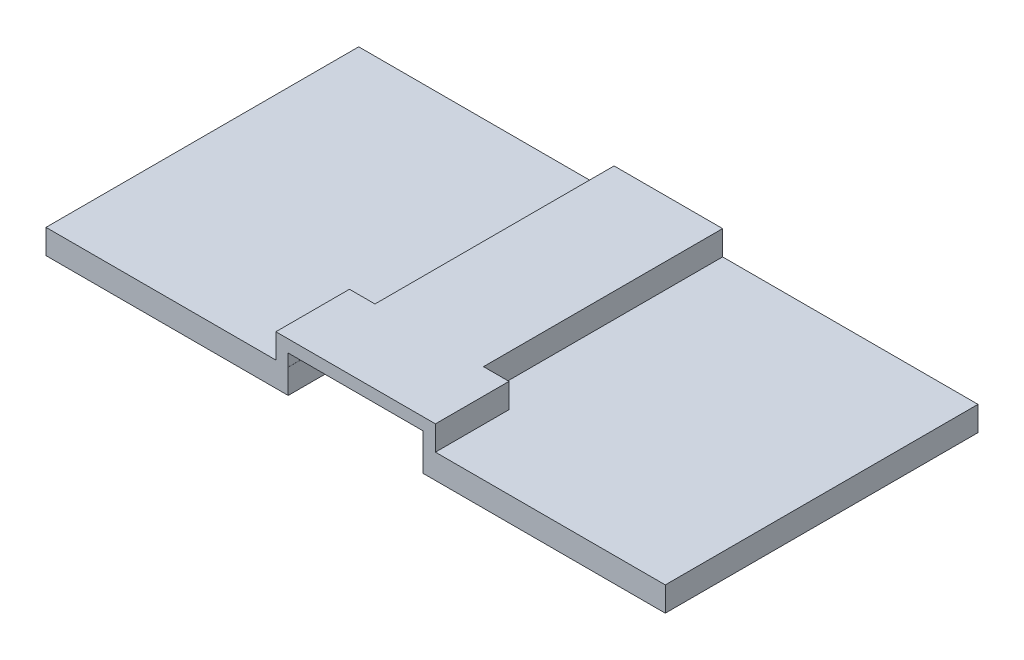
ISO-10303-21;
HEADER;
FILE_DESCRIPTION(('STEP AP214'),'2;1');
FILE_NAME('part.step','',(''),(''),'','','');
FILE_SCHEMA(('AUTOMOTIVE_DESIGN { 1 0 10303 214 1 1 1 1 }'));
ENDSEC;
DATA;
#1=APPLICATION_CONTEXT('core data for automotive mechanical design processes');
#2=APPLICATION_PROTOCOL_DEFINITION('international standard','automotive_design',2000,#1);
#3=PRODUCT_CONTEXT('',#1,'mechanical');
#4=PRODUCT('Part','Part','',(#3));
#5=PRODUCT_RELATED_PRODUCT_CATEGORY('part','',(#4));
#6=PRODUCT_DEFINITION_FORMATION('','',#4);
#7=PRODUCT_DEFINITION_CONTEXT('part definition',#1,'design');
#8=PRODUCT_DEFINITION('design','',#6,#7);
#9=PRODUCT_DEFINITION_SHAPE('','',#8);
#10=(LENGTH_UNIT() NAMED_UNIT(*) SI_UNIT(.MILLI.,.METRE.));
#11=(NAMED_UNIT(*) PLANE_ANGLE_UNIT() SI_UNIT($,.RADIAN.));
#12=(NAMED_UNIT(*) SI_UNIT($,.STERADIAN.) SOLID_ANGLE_UNIT());
#13=UNCERTAINTY_MEASURE_WITH_UNIT(LENGTH_MEASURE(1.E-05),#10,'distance_accuracy_value','');
#14=(GEOMETRIC_REPRESENTATION_CONTEXT(3) GLOBAL_UNCERTAINTY_ASSIGNED_CONTEXT((#13)) GLOBAL_UNIT_ASSIGNED_CONTEXT((#10,
#11,#12)) REPRESENTATION_CONTEXT('',''));
#15=CARTESIAN_POINT('',(0.,0.,0.));
#16=DIRECTION('',(0.,0.,1.));
#17=DIRECTION('',(1.,0.,0.));
#18=AXIS2_PLACEMENT_3D('',#15,#16,#17);
#19=CARTESIAN_POINT('',(0.,2.,0.));
#20=DIRECTION('',(0.,1.,0.));
#21=DIRECTION('',(0.,0.,1.));
#22=AXIS2_PLACEMENT_3D('',#19,#20,#21);
#23=PLANE('',#22);
#24=DIRECTION('',(0.,0.,-1.));
#25=VECTOR('',#24,1.);
#26=CARTESIAN_POINT('',(0.162134831460685,2.,11.8823735955056));
#27=LINE('',#26,#25);
#28=CARTESIAN_POINT('',(0.162134831460685,2.,16.8823735955056));
#29=VERTEX_POINT('',#28);
#30=CARTESIAN_POINT('',(0.162134831460685,2.,10.8823735955056));
#31=VERTEX_POINT('',#30);
#32=EDGE_CURVE('E222',#29,#31,#27,.T.);
#33=ORIENTED_EDGE('',*,*,#32,.T.);
#34=DIRECTION('',(-1.,0.,0.));
#35=VECTOR('',#34,1.);
#36=CARTESIAN_POINT('',(2.24213483146068,2.,10.8823735955056));
#37=LINE('',#36,#35);
#38=CARTESIAN_POINT('',(2.24213483146068,2.,10.8823735955056));
#39=VERTEX_POINT('',#38);
#40=EDGE_CURVE('E352',#39,#31,#37,.T.);
#41=ORIENTED_EDGE('',*,*,#40,.F.);
#42=DIRECTION('',(0.,0.,1.));
#43=VECTOR('',#42,1.);
#44=CARTESIAN_POINT('',(2.24213483146068,2.,-8.61762640449438));
#45=LINE('',#44,#43);
#46=CARTESIAN_POINT('',(2.24213483146068,2.,-8.61762640449438));
#47=VERTEX_POINT('',#46);
#48=EDGE_CURVE('E195',#47,#39,#45,.T.);
#49=ORIENTED_EDGE('',*,*,#48,.F.);
#50=DIRECTION('',(-1.,0.,0.));
#51=VECTOR('',#50,1.);
#52=CARTESIAN_POINT('',(-18.5828651685393,2.,-8.61762640449438));
#53=LINE('',#52,#51);
#54=CARTESIAN_POINT('',(-18.5828651685393,2.,-8.61762640449438));
#55=VERTEX_POINT('',#54);
#56=EDGE_CURVE('E276',#47,#55,#53,.T.);
#57=ORIENTED_EDGE('',*,*,#56,.T.);
#58=DIRECTION('',(0.,0.,1.));
#59=VECTOR('',#58,1.);
#60=CARTESIAN_POINT('',(-18.5828651685393,2.,-8.61762640449438));
#61=LINE('',#60,#59);
#62=CARTESIAN_POINT('',(-18.5828651685393,2.,16.8823735955056));
#63=VERTEX_POINT('',#62);
#64=EDGE_CURVE('E265',#55,#63,#61,.T.);
#65=ORIENTED_EDGE('',*,*,#64,.T.);
#66=DIRECTION('',(1.,0.,0.));
#67=VECTOR('',#66,1.);
#68=CARTESIAN_POINT('',(-18.5828651685393,2.,16.8823735955056));
#69=LINE('',#68,#67);
#70=EDGE_CURVE('E270',#63,#29,#69,.T.);
#71=ORIENTED_EDGE('',*,*,#70,.T.);
#72=EDGE_LOOP('',(#33,#41,#49,#57,#65,#71));
#73=FACE_BOUND('',#72,.T.);
#74=ADVANCED_FACE('F39',(#73),#23,.T.);
#75=DIRECTION('',(0.,0.,1.));
#76=VECTOR('',#75,1.);
#77=CARTESIAN_POINT('',(1.16713483146069,2.,11.8823735955056));
#78=LINE('',#77,#76);
#79=CARTESIAN_POINT('',(1.16713483146069,2.,11.8823735955056));
#80=VERTEX_POINT('',#79);
#81=CARTESIAN_POINT('',(1.16713483146069,2.,16.8823735955056));
#82=VERTEX_POINT('',#81);
#83=EDGE_CURVE('E238',#80,#82,#78,.T.);
#84=ORIENTED_EDGE('',*,*,#83,.F.);
#85=DIRECTION('',(1.,0.,0.));
#86=VECTOR('',#85,1.);
#87=CARTESIAN_POINT('',(2.24213483146068,2.,11.8823735955056));
#88=LINE('',#87,#86);
#89=CARTESIAN_POINT('',(1.16213483146068,2.,11.8823735955056));
#90=VERTEX_POINT('',#89);
#91=EDGE_CURVE('E187',#90,#80,#88,.T.);
#92=ORIENTED_EDGE('',*,*,#91,.F.);
#93=DIRECTION('',(0.,0.,1.));
#94=VECTOR('',#93,1.);
#95=CARTESIAN_POINT('',(1.16213483146068,2.,11.8823735955056));
#96=LINE('',#95,#94);
#97=CARTESIAN_POINT('',(1.16213483146068,2.,16.8823735955056));
#98=VERTEX_POINT('',#97);
#99=EDGE_CURVE('E224',#90,#98,#96,.T.);
#100=ORIENTED_EDGE('',*,*,#99,.T.);
#101=EDGE_CURVE('E274',#98,#82,#69,.T.);
#102=ORIENTED_EDGE('',*,*,#101,.T.);
#103=EDGE_LOOP('',(#84,#92,#100,#102));
#104=FACE_BOUND('',#103,.T.);
#105=ADVANCED_FACE('F387',(#104),#23,.T.);
#106=CARTESIAN_POINT('',(2.24213483146068,3.,-8.61762640449438));
#107=DIRECTION('',(1.,0.,0.));
#108=DIRECTION('',(0.,0.,-1.));
#109=AXIS2_PLACEMENT_3D('',#106,#107,#108);
#110=PLANE('',#109);
#111=DIRECTION('',(0.,-1.,0.));
#112=VECTOR('',#111,1.);
#113=CARTESIAN_POINT('',(2.24213483146068,4.,10.8823735955056));
#114=LINE('',#113,#112);
#115=CARTESIAN_POINT('',(2.24213483146068,4.,10.8823735955056));
#116=VERTEX_POINT('',#115);
#117=EDGE_CURVE('E180',#116,#39,#114,.T.);
#118=ORIENTED_EDGE('',*,*,#117,.F.);
#119=DIRECTION('',(0.,0.,1.));
#120=VECTOR('',#119,1.);
#121=CARTESIAN_POINT('',(2.24213483146068,4.,-8.61762640449438));
#122=LINE('',#121,#120);
#123=CARTESIAN_POINT('',(2.24213483146068,4.,-8.61762640449438));
#124=VERTEX_POINT('',#123);
#125=EDGE_CURVE('E193',#124,#116,#122,.T.);
#126=ORIENTED_EDGE('',*,*,#125,.F.);
#127=DIRECTION('',(0.,-1.,0.));
#128=VECTOR('',#127,1.);
#129=CARTESIAN_POINT('',(2.24213483146068,3.,-8.61762640449438));
#130=LINE('',#129,#128);
#131=EDGE_CURVE('E211',#124,#47,#130,.T.);
#132=ORIENTED_EDGE('',*,*,#131,.T.);
#133=ORIENTED_EDGE('',*,*,#48,.T.);
#134=EDGE_LOOP('',(#118,#126,#132,#133));
#135=FACE_BOUND('',#134,.T.);
#136=ADVANCED_FACE('F192',(#135),#110,.F.);
#137=DIRECTION('',(0.,0.,-1.));
#138=VECTOR('',#137,1.);
#139=CARTESIAN_POINT('',(12.1721348314607,2.,11.8823735955056));
#140=LINE('',#139,#138);
#141=CARTESIAN_POINT('',(12.1721348314607,2.,16.8823735955056));
#142=VERTEX_POINT('',#141);
#143=CARTESIAN_POINT('',(12.1721348314607,2.,11.8823735955056));
#144=VERTEX_POINT('',#143);
#145=EDGE_CURVE('E54',#142,#144,#140,.T.);
#146=ORIENTED_EDGE('',*,*,#145,.T.);
#147=DIRECTION('',(1.,0.,0.));
#148=VECTOR('',#147,1.);
#149=CARTESIAN_POINT('',(11.0921348314607,2.,11.8823735955056));
#150=LINE('',#149,#148);
#151=CARTESIAN_POINT('',(12.1671348314607,2.,11.8823735955056));
#152=VERTEX_POINT('',#151);
#153=EDGE_CURVE('E196',#152,#144,#150,.T.);
#154=ORIENTED_EDGE('',*,*,#153,.F.);
#155=DIRECTION('',(0.,0.,-1.));
#156=VECTOR('',#155,1.);
#157=CARTESIAN_POINT('',(12.1671348314607,2.,11.8823735955056));
#158=LINE('',#157,#156);
#159=CARTESIAN_POINT('',(12.1671348314607,2.,16.8823735955056));
#160=VERTEX_POINT('',#159);
#161=EDGE_CURVE('E243',#160,#152,#158,.T.);
#162=ORIENTED_EDGE('',*,*,#161,.F.);
#163=EDGE_CURVE('E59',#160,#142,#69,.T.);
#164=ORIENTED_EDGE('',*,*,#163,.T.);
#165=EDGE_LOOP('',(#146,#154,#162,#164));
#166=FACE_BOUND('',#165,.T.);
#167=ADVANCED_FACE('F383',(#166),#23,.T.);
#168=DIRECTION('',(-1.,0.,0.));
#169=VECTOR('',#168,1.);
#170=CARTESIAN_POINT('',(11.0921348314607,2.,10.8823735955056));
#171=LINE('',#170,#169);
#172=CARTESIAN_POINT('',(13.1721348314607,2.,10.8823735955056));
#173=VERTEX_POINT('',#172);
#174=CARTESIAN_POINT('',(11.0921348314607,2.,10.8823735955056));
#175=VERTEX_POINT('',#174);
#176=EDGE_CURVE('E345',#173,#175,#171,.T.);
#177=ORIENTED_EDGE('',*,*,#176,.F.);
#178=DIRECTION('',(0.,0.,1.));
#179=VECTOR('',#178,1.);
#180=CARTESIAN_POINT('',(13.1721348314607,2.,11.8823735955056));
#181=LINE('',#180,#179);
#182=CARTESIAN_POINT('',(13.1721348314607,2.,16.8823735955056));
#183=VERTEX_POINT('',#182);
#184=EDGE_CURVE('E334',#173,#183,#181,.T.);
#185=ORIENTED_EDGE('',*,*,#184,.T.);
#186=CARTESIAN_POINT('',(31.9171348314607,2.,16.8823735955056));
#187=VERTEX_POINT('',#186);
#188=EDGE_CURVE('E268',#183,#187,#69,.T.);
#189=ORIENTED_EDGE('',*,*,#188,.T.);
#190=DIRECTION('',(0.,0.,-1.));
#191=VECTOR('',#190,1.);
#192=CARTESIAN_POINT('',(31.9171348314607,2.,-8.61762640449438));
#193=LINE('',#192,#191);
#194=CARTESIAN_POINT('',(31.9171348314607,2.,-8.61762640449438));
#195=VERTEX_POINT('',#194);
#196=EDGE_CURVE('E273',#187,#195,#193,.T.);
#197=ORIENTED_EDGE('',*,*,#196,.T.);
#198=CARTESIAN_POINT('',(11.0921348314607,2.,-8.61762640449438));
#199=VERTEX_POINT('',#198);
#200=EDGE_CURVE('E277',#195,#199,#53,.T.);
#201=ORIENTED_EDGE('',*,*,#200,.T.);
#202=DIRECTION('',(0.,0.,-1.));
#203=VECTOR('',#202,1.);
#204=CARTESIAN_POINT('',(11.0921348314607,2.,-8.61762640449438));
#205=LINE('',#204,#203);
#206=EDGE_CURVE('E203',#175,#199,#205,.T.);
#207=ORIENTED_EDGE('',*,*,#206,.F.);
#208=EDGE_LOOP('',(#177,#185,#189,#197,#201,#207));
#209=FACE_BOUND('',#208,.T.);
#210=ADVANCED_FACE('F364',(#209),#23,.T.);
#211=CARTESIAN_POINT('',(11.0921348314607,3.,-8.61762640449438));
#212=DIRECTION('',(-1.,0.,0.));
#213=DIRECTION('',(0.,0.,1.));
#214=AXIS2_PLACEMENT_3D('',#211,#212,#213);
#215=PLANE('',#214);
#216=DIRECTION('',(0.,-1.,0.));
#217=VECTOR('',#216,1.);
#218=CARTESIAN_POINT('',(11.0921348314607,4.,10.8823735955056));
#219=LINE('',#218,#217);
#220=CARTESIAN_POINT('',(11.0921348314607,4.,10.8823735955056));
#221=VERTEX_POINT('',#220);
#222=EDGE_CURVE('E341',#221,#175,#219,.T.);
#223=ORIENTED_EDGE('',*,*,#222,.T.);
#224=ORIENTED_EDGE('',*,*,#206,.T.);
#225=DIRECTION('',(0.,-1.,0.));
#226=VECTOR('',#225,1.);
#227=CARTESIAN_POINT('',(11.0921348314607,3.,-8.61762640449438));
#228=LINE('',#227,#226);
#229=CARTESIAN_POINT('',(11.0921348314607,4.,-8.61762640449438));
#230=VERTEX_POINT('',#229);
#231=EDGE_CURVE('E209',#230,#199,#228,.T.);
#232=ORIENTED_EDGE('',*,*,#231,.F.);
#233=DIRECTION('',(0.,0.,-1.));
#234=VECTOR('',#233,1.);
#235=CARTESIAN_POINT('',(11.0921348314607,4.,-8.61762640449438));
#236=LINE('',#235,#234);
#237=EDGE_CURVE('E202',#221,#230,#236,.T.);
#238=ORIENTED_EDGE('',*,*,#237,.F.);
#239=EDGE_LOOP('',(#223,#224,#232,#238));
#240=FACE_BOUND('',#239,.T.);
#241=ADVANCED_FACE('F372',(#240),#215,.F.);
#242=CARTESIAN_POINT('',(2.24213483146069,3.,16.8823735955056));
#243=DIRECTION('',(0.,1.,0.));
#244=DIRECTION('',(0.,0.,1.));
#245=AXIS2_PLACEMENT_3D('',#242,#243,#244);
#246=PLANE('',#245);
#247=DIRECTION('',(0.,0.,-1.));
#248=VECTOR('',#247,1.);
#249=CARTESIAN_POINT('',(12.1721348314607,3.,11.8823735955056));
#250=LINE('',#249,#248);
#251=CARTESIAN_POINT('',(12.1721348314607,3.,16.8823735955056));
#252=VERTEX_POINT('',#251);
#253=CARTESIAN_POINT('',(12.1721348314607,3.,11.8823735955056));
#254=VERTEX_POINT('',#253);
#255=EDGE_CURVE('E331',#252,#254,#250,.T.);
#256=ORIENTED_EDGE('',*,*,#255,.F.);
#257=DIRECTION('',(1.,0.,0.));
#258=VECTOR('',#257,1.);
#259=CARTESIAN_POINT('',(2.24213483146069,3.,16.8823735955056));
#260=LINE('',#259,#258);
#261=CARTESIAN_POINT('',(1.16213483146068,3.,16.8823735955056));
#262=VERTEX_POINT('',#261);
#263=EDGE_CURVE('E322',#262,#252,#260,.T.);
#264=ORIENTED_EDGE('',*,*,#263,.F.);
#265=DIRECTION('',(0.,0.,1.));
#266=VECTOR('',#265,1.);
#267=CARTESIAN_POINT('',(1.16213483146068,3.,11.8823735955056));
#268=LINE('',#267,#266);
#269=CARTESIAN_POINT('',(1.16213483146068,3.,11.8823735955056));
#270=VERTEX_POINT('',#269);
#271=EDGE_CURVE('E225',#270,#262,#268,.T.);
#272=ORIENTED_EDGE('',*,*,#271,.F.);
#273=DIRECTION('',(1.,0.,0.));
#274=VECTOR('',#273,1.);
#275=CARTESIAN_POINT('',(2.24213483146069,3.,11.8823735955056));
#276=LINE('',#275,#274);
#277=EDGE_CURVE('E221',#270,#254,#276,.T.);
#278=ORIENTED_EDGE('',*,*,#277,.T.);
#279=EDGE_LOOP('',(#256,#264,#272,#278));
#280=FACE_BOUND('',#279,.T.);
#281=ADVANCED_FACE('F374',(#280),#246,.F.);
#282=CARTESIAN_POINT('',(-18.5828651685393,2.,-8.61762640449438));
#283=DIRECTION('',(1.,0.,0.));
#284=DIRECTION('',(0.,0.,-1.));
#285=AXIS2_PLACEMENT_3D('',#282,#283,#284);
#286=PLANE('',#285);
#287=DIRECTION('',(0.,0.,1.));
#288=VECTOR('',#287,1.);
#289=CARTESIAN_POINT('',(-18.5828651685393,0.,-8.61762640449438));
#290=LINE('',#289,#288);
#291=CARTESIAN_POINT('',(-18.5828651685393,0.,-8.61762640449438));
#292=VERTEX_POINT('',#291);
#293=CARTESIAN_POINT('',(-18.5828651685393,0.,16.8823735955056));
#294=VERTEX_POINT('',#293);
#295=EDGE_CURVE('E257',#292,#294,#290,.T.);
#296=ORIENTED_EDGE('',*,*,#295,.T.);
#297=DIRECTION('',(0.,-1.,0.));
#298=VECTOR('',#297,1.);
#299=CARTESIAN_POINT('',(-18.5828651685393,2.,16.8823735955056));
#300=LINE('',#299,#298);
#301=EDGE_CURVE('E12',#63,#294,#300,.T.);
#302=ORIENTED_EDGE('',*,*,#301,.F.);
#303=ORIENTED_EDGE('',*,*,#64,.F.);
#304=DIRECTION('',(0.,-1.,0.));
#305=VECTOR('',#304,1.);
#306=CARTESIAN_POINT('',(-18.5828651685393,2.,-8.61762640449438));
#307=LINE('',#306,#305);
#308=EDGE_CURVE('E280',#55,#292,#307,.T.);
#309=ORIENTED_EDGE('',*,*,#308,.T.);
#310=EDGE_LOOP('',(#296,#302,#303,#309));
#311=FACE_BOUND('',#310,.T.);
#312=ADVANCED_FACE('F41',(#311),#286,.F.);
#313=CARTESIAN_POINT('',(-18.5828651685393,2.,16.8823735955056));
#314=DIRECTION('',(0.,0.,-1.));
#315=DIRECTION('',(-1.,0.,0.));
#316=AXIS2_PLACEMENT_3D('',#313,#314,#315);
#317=PLANE('',#316);
#318=ORIENTED_EDGE('',*,*,#163,.F.);
#319=DIRECTION('',(0.,1.,0.));
#320=VECTOR('',#319,1.);
#321=CARTESIAN_POINT('',(12.1671348314607,0.,16.8823735955056));
#322=LINE('',#321,#320);
#323=CARTESIAN_POINT('',(12.1671348314607,0.,16.8823735955056));
#324=VERTEX_POINT('',#323);
#325=EDGE_CURVE('E261',#324,#160,#322,.T.);
#326=ORIENTED_EDGE('',*,*,#325,.F.);
#327=DIRECTION('',(1.,0.,0.));
#328=VECTOR('',#327,1.);
#329=CARTESIAN_POINT('',(-18.5828651685393,0.,16.8823735955056));
#330=LINE('',#329,#328);
#331=CARTESIAN_POINT('',(31.9171348314607,0.,16.8823735955056));
#332=VERTEX_POINT('',#331);
#333=EDGE_CURVE('E283',#324,#332,#330,.T.);
#334=ORIENTED_EDGE('',*,*,#333,.T.);
#335=DIRECTION('',(0.,-1.,0.));
#336=VECTOR('',#335,1.);
#337=CARTESIAN_POINT('',(31.9171348314607,2.,16.8823735955056));
#338=LINE('',#337,#336);
#339=EDGE_CURVE('E47',#187,#332,#338,.T.);
#340=ORIENTED_EDGE('',*,*,#339,.F.);
#341=ORIENTED_EDGE('',*,*,#188,.F.);
#342=DIRECTION('',(0.,1.,0.));
#343=VECTOR('',#342,1.);
#344=CARTESIAN_POINT('',(13.1721348314607,3.,16.8823735955056));
#345=LINE('',#344,#343);
#346=CARTESIAN_POINT('',(13.1721348314607,4.,16.8823735955056));
#347=VERTEX_POINT('',#346);
#348=EDGE_CURVE('E215',#183,#347,#345,.T.);
#349=ORIENTED_EDGE('',*,*,#348,.T.);
#350=DIRECTION('',(-1.,0.,0.));
#351=VECTOR('',#350,1.);
#352=CARTESIAN_POINT('',(2.24213483146069,4.,16.8823735955056));
#353=LINE('',#352,#351);
#354=CARTESIAN_POINT('',(0.162134831460687,4.,16.8823735955056));
#355=VERTEX_POINT('',#354);
#356=EDGE_CURVE('E320',#347,#355,#353,.T.);
#357=ORIENTED_EDGE('',*,*,#356,.T.);
#358=DIRECTION('',(0.,1.,0.));
#359=VECTOR('',#358,1.);
#360=CARTESIAN_POINT('',(0.162134831460685,2.,16.8823735955056));
#361=LINE('',#360,#359);
#362=EDGE_CURVE('E228',#29,#355,#361,.T.);
#363=ORIENTED_EDGE('',*,*,#362,.F.);
#364=ORIENTED_EDGE('',*,*,#70,.F.);
#365=ORIENTED_EDGE('',*,*,#301,.T.);
#366=CARTESIAN_POINT('',(1.16713483146069,0.,16.8823735955056));
#367=VERTEX_POINT('',#366);
#368=EDGE_CURVE('E284',#294,#367,#330,.T.);
#369=ORIENTED_EDGE('',*,*,#368,.T.);
#370=DIRECTION('',(0.,1.,0.));
#371=VECTOR('',#370,1.);
#372=CARTESIAN_POINT('',(1.16713483146069,0.,16.8823735955056));
#373=LINE('',#372,#371);
#374=EDGE_CURVE('E249',#367,#82,#373,.T.);
#375=ORIENTED_EDGE('',*,*,#374,.T.);
#376=ORIENTED_EDGE('',*,*,#101,.F.);
#377=DIRECTION('',(0.,1.,0.));
#378=VECTOR('',#377,1.);
#379=CARTESIAN_POINT('',(1.16213483146068,2.,16.8823735955056));
#380=LINE('',#379,#378);
#381=EDGE_CURVE('E232',#98,#262,#380,.T.);
#382=ORIENTED_EDGE('',*,*,#381,.T.);
#383=ORIENTED_EDGE('',*,*,#263,.T.);
#384=DIRECTION('',(0.,1.,0.));
#385=VECTOR('',#384,1.);
#386=CARTESIAN_POINT('',(12.1721348314607,2.,16.8823735955056));
#387=LINE('',#386,#385);
#388=EDGE_CURVE('E216',#142,#252,#387,.T.);
#389=ORIENTED_EDGE('',*,*,#388,.F.);
#390=EDGE_LOOP('',(#318,#326,#334,#340,#341,#349,#357,#363,#364,#365,#369,#375,#376,#382,#383,#389));
#391=FACE_BOUND('',#390,.T.);
#392=ADVANCED_FACE('F361',(#391),#317,.F.);
#393=CARTESIAN_POINT('',(31.9171348314607,2.,-8.61762640449438));
#394=DIRECTION('',(-1.,0.,0.));
#395=DIRECTION('',(0.,0.,1.));
#396=AXIS2_PLACEMENT_3D('',#393,#394,#395);
#397=PLANE('',#396);
#398=DIRECTION('',(0.,0.,-1.));
#399=VECTOR('',#398,1.);
#400=CARTESIAN_POINT('',(31.9171348314607,0.,-8.61762640449438));
#401=LINE('',#400,#399);
#402=CARTESIAN_POINT('',(31.9171348314607,0.,-8.61762640449438));
#403=VERTEX_POINT('',#402);
#404=EDGE_CURVE('E287',#332,#403,#401,.T.);
#405=ORIENTED_EDGE('',*,*,#404,.T.);
#406=DIRECTION('',(0.,-1.,0.));
#407=VECTOR('',#406,1.);
#408=CARTESIAN_POINT('',(31.9171348314607,2.,-8.61762640449438));
#409=LINE('',#408,#407);
#410=EDGE_CURVE('E292',#195,#403,#409,.T.);
#411=ORIENTED_EDGE('',*,*,#410,.F.);
#412=ORIENTED_EDGE('',*,*,#196,.F.);
#413=ORIENTED_EDGE('',*,*,#339,.T.);
#414=EDGE_LOOP('',(#405,#411,#412,#413));
#415=FACE_BOUND('',#414,.T.);
#416=ADVANCED_FACE('F299',(#415),#397,.F.);
#417=CARTESIAN_POINT('',(-18.5828651685393,2.,-8.61762640449438));
#418=DIRECTION('',(0.,0.,1.));
#419=DIRECTION('',(1.,0.,0.));
#420=AXIS2_PLACEMENT_3D('',#417,#418,#419);
#421=PLANE('',#420);
#422=DIRECTION('',(-1.,0.,0.));
#423=VECTOR('',#422,1.);
#424=CARTESIAN_POINT('',(-18.5828651685393,0.,-8.61762640449438));
#425=LINE('',#424,#423);
#426=EDGE_CURVE('E269',#403,#292,#425,.T.);
#427=ORIENTED_EDGE('',*,*,#426,.T.);
#428=ORIENTED_EDGE('',*,*,#308,.F.);
#429=ORIENTED_EDGE('',*,*,#56,.F.);
#430=ORIENTED_EDGE('',*,*,#131,.F.);
#431=DIRECTION('',(-1.,0.,0.));
#432=VECTOR('',#431,1.);
#433=CARTESIAN_POINT('',(2.24213483146068,4.,-8.61762640449438));
#434=LINE('',#433,#432);
#435=EDGE_CURVE('E200',#230,#124,#434,.T.);
#436=ORIENTED_EDGE('',*,*,#435,.F.);
#437=ORIENTED_EDGE('',*,*,#231,.T.);
#438=ORIENTED_EDGE('',*,*,#200,.F.);
#439=ORIENTED_EDGE('',*,*,#410,.T.);
#440=EDGE_LOOP('',(#427,#428,#429,#430,#436,#437,#438,#439));
#441=FACE_BOUND('',#440,.T.);
#442=ADVANCED_FACE('F310',(#441),#421,.F.);
#443=CARTESIAN_POINT('',(0.,0.,0.));
#444=DIRECTION('',(0.,1.,0.));
#445=DIRECTION('',(0.,0.,1.));
#446=AXIS2_PLACEMENT_3D('',#443,#444,#445);
#447=PLANE('',#446);
#448=DIRECTION('',(-1.,0.,0.));
#449=VECTOR('',#448,1.);
#450=CARTESIAN_POINT('',(1.16713483146069,0.,11.8823735955056));
#451=LINE('',#450,#449);
#452=CARTESIAN_POINT('',(12.1671348314607,0.,11.8823735955056));
#453=VERTEX_POINT('',#452);
#454=CARTESIAN_POINT('',(1.16713483146069,0.,11.8823735955056));
#455=VERTEX_POINT('',#454);
#456=EDGE_CURVE('E246',#453,#455,#451,.T.);
#457=ORIENTED_EDGE('',*,*,#456,.T.);
#458=DIRECTION('',(0.,0.,1.));
#459=VECTOR('',#458,1.);
#460=CARTESIAN_POINT('',(1.16713483146069,0.,11.8823735955056));
#461=LINE('',#460,#459);
#462=EDGE_CURVE('E239',#455,#367,#461,.T.);
#463=ORIENTED_EDGE('',*,*,#462,.T.);
#464=ORIENTED_EDGE('',*,*,#368,.F.);
#465=ORIENTED_EDGE('',*,*,#295,.F.);
#466=ORIENTED_EDGE('',*,*,#426,.F.);
#467=ORIENTED_EDGE('',*,*,#404,.F.);
#468=ORIENTED_EDGE('',*,*,#333,.F.);
#469=DIRECTION('',(0.,0.,-1.));
#470=VECTOR('',#469,1.);
#471=CARTESIAN_POINT('',(12.1671348314607,0.,11.8823735955056));
#472=LINE('',#471,#470);
#473=EDGE_CURVE('E242',#324,#453,#472,.T.);
#474=ORIENTED_EDGE('',*,*,#473,.T.);
#475=EDGE_LOOP('',(#457,#463,#464,#465,#466,#467,#468,#474));
#476=FACE_BOUND('',#475,.T.);
#477=ADVANCED_FACE('F306',(#476),#447,.F.);
#478=CARTESIAN_POINT('',(1.16713483146069,0.,11.8823735955056));
#479=DIRECTION('',(-1.,0.,0.));
#480=DIRECTION('',(0.,0.,1.));
#481=AXIS2_PLACEMENT_3D('',#478,#479,#480);
#482=PLANE('',#481);
#483=ORIENTED_EDGE('',*,*,#83,.T.);
#484=ORIENTED_EDGE('',*,*,#374,.F.);
#485=ORIENTED_EDGE('',*,*,#462,.F.);
#486=DIRECTION('',(0.,1.,0.));
#487=VECTOR('',#486,1.);
#488=CARTESIAN_POINT('',(1.16713483146069,0.,11.8823735955056));
#489=LINE('',#488,#487);
#490=EDGE_CURVE('E254',#455,#80,#489,.T.);
#491=ORIENTED_EDGE('',*,*,#490,.T.);
#492=EDGE_LOOP('',(#483,#484,#485,#491));
#493=FACE_BOUND('',#492,.T.);
#494=ADVANCED_FACE('F395',(#493),#482,.F.);
#495=CARTESIAN_POINT('',(1.16713483146069,0.,11.8823735955056));
#496=DIRECTION('',(0.,0.,-1.));
#497=DIRECTION('',(-1.,0.,0.));
#498=AXIS2_PLACEMENT_3D('',#495,#496,#497);
#499=PLANE('',#498);
#500=ORIENTED_EDGE('',*,*,#91,.T.);
#501=ORIENTED_EDGE('',*,*,#490,.F.);
#502=ORIENTED_EDGE('',*,*,#456,.F.);
#503=DIRECTION('',(0.,1.,0.));
#504=VECTOR('',#503,1.);
#505=CARTESIAN_POINT('',(12.1671348314607,0.,11.8823735955056));
#506=LINE('',#505,#504);
#507=EDGE_CURVE('E258',#453,#152,#506,.T.);
#508=ORIENTED_EDGE('',*,*,#507,.T.);
#509=ORIENTED_EDGE('',*,*,#153,.T.);
#510=DIRECTION('',(0.,1.,0.));
#511=VECTOR('',#510,1.);
#512=CARTESIAN_POINT('',(12.1721348314607,2.,11.8823735955056));
#513=LINE('',#512,#511);
#514=EDGE_CURVE('E328',#144,#254,#513,.T.);
#515=ORIENTED_EDGE('',*,*,#514,.T.);
#516=ORIENTED_EDGE('',*,*,#277,.F.);
#517=DIRECTION('',(0.,1.,0.));
#518=VECTOR('',#517,1.);
#519=CARTESIAN_POINT('',(1.16213483146068,2.,11.8823735955056));
#520=LINE('',#519,#518);
#521=EDGE_CURVE('E235',#90,#270,#520,.T.);
#522=ORIENTED_EDGE('',*,*,#521,.F.);
#523=EDGE_LOOP('',(#500,#501,#502,#508,#509,#515,#516,#522));
#524=FACE_BOUND('',#523,.T.);
#525=ADVANCED_FACE('F423',(#524),#499,.F.);
#526=CARTESIAN_POINT('',(12.1671348314607,0.,11.8823735955056));
#527=DIRECTION('',(1.,0.,0.));
#528=DIRECTION('',(0.,0.,-1.));
#529=AXIS2_PLACEMENT_3D('',#526,#527,#528);
#530=PLANE('',#529);
#531=ORIENTED_EDGE('',*,*,#161,.T.);
#532=ORIENTED_EDGE('',*,*,#507,.F.);
#533=ORIENTED_EDGE('',*,*,#473,.F.);
#534=ORIENTED_EDGE('',*,*,#325,.T.);
#535=EDGE_LOOP('',(#531,#532,#533,#534));
#536=FACE_BOUND('',#535,.T.);
#537=ADVANCED_FACE('F431',(#536),#530,.F.);
#538=CARTESIAN_POINT('',(0.162134831460685,2.,11.8823735955056));
#539=DIRECTION('',(1.,0.,0.));
#540=DIRECTION('',(0.,0.,-1.));
#541=AXIS2_PLACEMENT_3D('',#538,#539,#540);
#542=PLANE('',#541);
#543=ORIENTED_EDGE('',*,*,#362,.T.);
#544=DIRECTION('',(0.,0.,-1.));
#545=VECTOR('',#544,1.);
#546=CARTESIAN_POINT('',(0.162134831460687,4.,16.8823735955056));
#547=LINE('',#546,#545);
#548=CARTESIAN_POINT('',(0.162134831460685,4.,10.8823735955056));
#549=VERTEX_POINT('',#548);
#550=EDGE_CURVE('E213',#355,#549,#547,.T.);
#551=ORIENTED_EDGE('',*,*,#550,.T.);
#552=DIRECTION('',(0.,-1.,0.));
#553=VECTOR('',#552,1.);
#554=CARTESIAN_POINT('',(0.162134831460685,4.,10.8823735955056));
#555=LINE('',#554,#553);
#556=EDGE_CURVE('E183',#549,#31,#555,.T.);
#557=ORIENTED_EDGE('',*,*,#556,.T.);
#558=ORIENTED_EDGE('',*,*,#32,.F.);
#559=EDGE_LOOP('',(#543,#551,#557,#558));
#560=FACE_BOUND('',#559,.T.);
#561=ADVANCED_FACE('F355',(#560),#542,.F.);
#562=CARTESIAN_POINT('',(1.16213483146068,2.,11.8823735955056));
#563=DIRECTION('',(-1.,0.,0.));
#564=DIRECTION('',(0.,0.,1.));
#565=AXIS2_PLACEMENT_3D('',#562,#563,#564);
#566=PLANE('',#565);
#567=ORIENTED_EDGE('',*,*,#271,.T.);
#568=ORIENTED_EDGE('',*,*,#381,.F.);
#569=ORIENTED_EDGE('',*,*,#99,.F.);
#570=ORIENTED_EDGE('',*,*,#521,.T.);
#571=EDGE_LOOP('',(#567,#568,#569,#570));
#572=FACE_BOUND('',#571,.T.);
#573=ADVANCED_FACE('F507',(#572),#566,.F.);
#574=CARTESIAN_POINT('',(0.,4.,0.));
#575=DIRECTION('',(0.,1.,0.));
#576=DIRECTION('',(0.,0.,1.));
#577=AXIS2_PLACEMENT_3D('',#574,#575,#576);
#578=PLANE('',#577);
#579=ORIENTED_EDGE('',*,*,#125,.T.);
#580=DIRECTION('',(-1.,0.,0.));
#581=VECTOR('',#580,1.);
#582=CARTESIAN_POINT('',(2.24213483146068,4.,10.8823735955056));
#583=LINE('',#582,#581);
#584=EDGE_CURVE('E176',#116,#549,#583,.T.);
#585=ORIENTED_EDGE('',*,*,#584,.T.);
#586=ORIENTED_EDGE('',*,*,#550,.F.);
#587=ORIENTED_EDGE('',*,*,#356,.F.);
#588=DIRECTION('',(0.,0.,-1.));
#589=VECTOR('',#588,1.);
#590=CARTESIAN_POINT('',(13.1721348314607,4.,16.8823735955056));
#591=LINE('',#590,#589);
#592=CARTESIAN_POINT('',(13.1721348314607,4.,10.8823735955056));
#593=VERTEX_POINT('',#592);
#594=EDGE_CURVE('E219',#347,#593,#591,.T.);
#595=ORIENTED_EDGE('',*,*,#594,.T.);
#596=DIRECTION('',(-1.,0.,0.));
#597=VECTOR('',#596,1.);
#598=CARTESIAN_POINT('',(11.0921348314607,4.,10.8823735955056));
#599=LINE('',#598,#597);
#600=EDGE_CURVE('E344',#593,#221,#599,.T.);
#601=ORIENTED_EDGE('',*,*,#600,.T.);
#602=ORIENTED_EDGE('',*,*,#237,.T.);
#603=ORIENTED_EDGE('',*,*,#435,.T.);
#604=EDGE_LOOP('',(#579,#585,#586,#587,#595,#601,#602,#603));
#605=FACE_BOUND('',#604,.T.);
#606=ADVANCED_FACE('F198',(#605),#578,.T.);
#607=CARTESIAN_POINT('',(13.1721348314607,0.,0.));
#608=DIRECTION('',(-1.,0.,0.));
#609=DIRECTION('',(0.,0.,1.));
#610=AXIS2_PLACEMENT_3D('',#607,#608,#609);
#611=PLANE('',#610);
#612=ORIENTED_EDGE('',*,*,#348,.F.);
#613=ORIENTED_EDGE('',*,*,#184,.F.);
#614=DIRECTION('',(0.,-1.,0.));
#615=VECTOR('',#614,1.);
#616=CARTESIAN_POINT('',(13.1721348314607,4.,10.8823735955056));
#617=LINE('',#616,#615);
#618=EDGE_CURVE('E335',#593,#173,#617,.T.);
#619=ORIENTED_EDGE('',*,*,#618,.F.);
#620=ORIENTED_EDGE('',*,*,#594,.F.);
#621=EDGE_LOOP('',(#612,#613,#619,#620));
#622=FACE_BOUND('',#621,.T.);
#623=ADVANCED_FACE('F359',(#622),#611,.F.);
#624=CARTESIAN_POINT('',(12.1721348314607,2.,11.8823735955056));
#625=DIRECTION('',(1.,0.,0.));
#626=DIRECTION('',(0.,0.,-1.));
#627=AXIS2_PLACEMENT_3D('',#624,#625,#626);
#628=PLANE('',#627);
#629=ORIENTED_EDGE('',*,*,#255,.T.);
#630=ORIENTED_EDGE('',*,*,#514,.F.);
#631=ORIENTED_EDGE('',*,*,#145,.F.);
#632=ORIENTED_EDGE('',*,*,#388,.T.);
#633=EDGE_LOOP('',(#629,#630,#631,#632));
#634=FACE_BOUND('',#633,.T.);
#635=ADVANCED_FACE('F531',(#634),#628,.F.);
#636=CARTESIAN_POINT('',(11.0921348314607,4.,10.8823735955056));
#637=DIRECTION('',(0.,0.,1.));
#638=DIRECTION('',(1.,0.,0.));
#639=AXIS2_PLACEMENT_3D('',#636,#637,#638);
#640=PLANE('',#639);
#641=ORIENTED_EDGE('',*,*,#176,.T.);
#642=ORIENTED_EDGE('',*,*,#222,.F.);
#643=ORIENTED_EDGE('',*,*,#600,.F.);
#644=ORIENTED_EDGE('',*,*,#618,.T.);
#645=EDGE_LOOP('',(#641,#642,#643,#644));
#646=FACE_BOUND('',#645,.T.);
#647=ADVANCED_FACE('F367',(#646),#640,.F.);
#648=CARTESIAN_POINT('',(2.24213483146068,4.,10.8823735955056));
#649=DIRECTION('',(0.,0.,1.));
#650=DIRECTION('',(1.,0.,0.));
#651=AXIS2_PLACEMENT_3D('',#648,#649,#650);
#652=PLANE('',#651);
#653=ORIENTED_EDGE('',*,*,#40,.T.);
#654=ORIENTED_EDGE('',*,*,#556,.F.);
#655=ORIENTED_EDGE('',*,*,#584,.F.);
#656=ORIENTED_EDGE('',*,*,#117,.T.);
#657=EDGE_LOOP('',(#653,#654,#655,#656));
#658=FACE_BOUND('',#657,.T.);
#659=ADVANCED_FACE('F179',(#658),#652,.F.);
#660=CLOSED_SHELL('',(#74,#105,#136,#167,#210,#241,#281,#312,#392,#416,#442,#477,#494,#525,#537,
#561,#573,#606,#623,#635,#647,#659));
#661=MANIFOLD_SOLID_BREP('B2',#660);
#662=ADVANCED_BREP_SHAPE_REPRESENTATION('',(#18,#661),#14);
#663=SHAPE_DEFINITION_REPRESENTATION(#9,#662);
ENDSEC;
END-ISO-10303-21;
